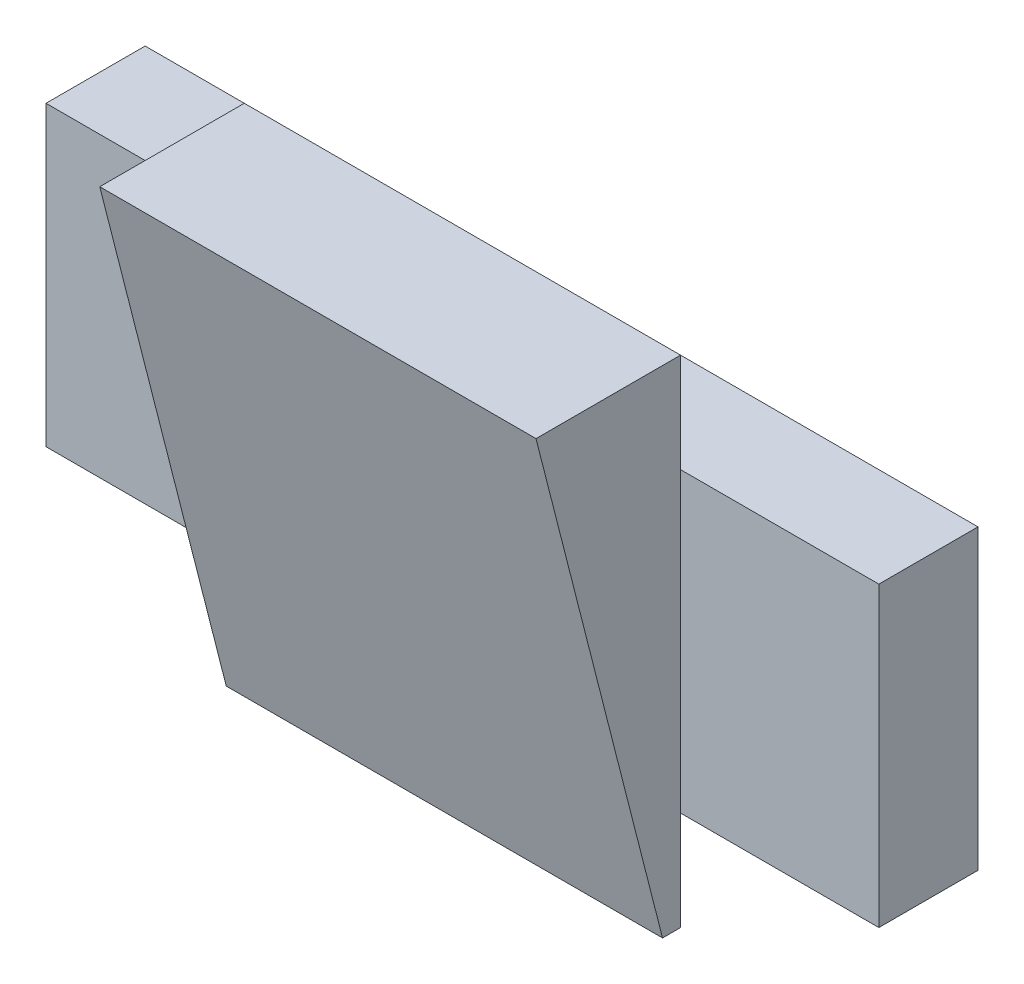
ISO-10303-21;
HEADER;
FILE_DESCRIPTION(('STEP AP214'),'2;1');
FILE_NAME('part.step','',(''),(''),'','','');
FILE_SCHEMA(('AUTOMOTIVE_DESIGN { 1 0 10303 214 1 1 1 1 }'));
ENDSEC;
DATA;
#1=APPLICATION_CONTEXT('core data for automotive mechanical design processes');
#2=APPLICATION_PROTOCOL_DEFINITION('international standard','automotive_design',2000,#1);
#3=PRODUCT_CONTEXT('',#1,'mechanical');
#4=PRODUCT('Part','Part','',(#3));
#5=PRODUCT_RELATED_PRODUCT_CATEGORY('part','',(#4));
#6=PRODUCT_DEFINITION_FORMATION('','',#4);
#7=PRODUCT_DEFINITION_CONTEXT('part definition',#1,'design');
#8=PRODUCT_DEFINITION('design','',#6,#7);
#9=PRODUCT_DEFINITION_SHAPE('','',#8);
#10=(LENGTH_UNIT() NAMED_UNIT(*) SI_UNIT(.MILLI.,.METRE.));
#11=(NAMED_UNIT(*) PLANE_ANGLE_UNIT() SI_UNIT($,.RADIAN.));
#12=(NAMED_UNIT(*) SI_UNIT($,.STERADIAN.) SOLID_ANGLE_UNIT());
#13=UNCERTAINTY_MEASURE_WITH_UNIT(LENGTH_MEASURE(1.E-05),#10,'distance_accuracy_value','');
#14=(GEOMETRIC_REPRESENTATION_CONTEXT(3) GLOBAL_UNCERTAINTY_ASSIGNED_CONTEXT((#13)) GLOBAL_UNIT_ASSIGNED_CONTEXT((#10,
#11,#12)) REPRESENTATION_CONTEXT('',''));
#15=CARTESIAN_POINT('',(0.,0.,0.));
#16=DIRECTION('',(0.,0.,1.));
#17=DIRECTION('',(1.,0.,0.));
#18=AXIS2_PLACEMENT_3D('',#15,#16,#17);
#19=CARTESIAN_POINT('',(0.,0.,5.));
#20=DIRECTION('',(0.,0.,-1.));
#21=DIRECTION('',(-1.,0.,0.));
#22=AXIS2_PLACEMENT_3D('',#19,#20,#21);
#23=PLANE('',#22);
#24=DIRECTION('',(0.,1.,0.));
#25=VECTOR('',#24,1.);
#26=CARTESIAN_POINT('',(11.,-12.5,5.));
#27=LINE('',#26,#25);
#28=CARTESIAN_POINT('',(11.,-7.5,5.));
#29=VERTEX_POINT('',#28);
#30=CARTESIAN_POINT('',(11.,7.5,5.));
#31=VERTEX_POINT('',#30);
#32=EDGE_CURVE('E11',#29,#31,#27,.T.);
#33=ORIENTED_EDGE('',*,*,#32,.F.);
#34=DIRECTION('',(1.,0.,0.));
#35=VECTOR('',#34,1.);
#36=CARTESIAN_POINT('',(-21.,-7.5,5.));
#37=LINE('',#36,#35);
#38=CARTESIAN_POINT('',(21.,-7.5,5.));
#39=VERTEX_POINT('',#38);
#40=EDGE_CURVE('E173',#29,#39,#37,.T.);
#41=ORIENTED_EDGE('',*,*,#40,.T.);
#42=DIRECTION('',(0.,1.,0.));
#43=VECTOR('',#42,1.);
#44=CARTESIAN_POINT('',(21.,-7.5,5.));
#45=LINE('',#44,#43);
#46=CARTESIAN_POINT('',(21.,7.5,5.));
#47=VERTEX_POINT('',#46);
#48=EDGE_CURVE('E159',#39,#47,#45,.T.);
#49=ORIENTED_EDGE('',*,*,#48,.T.);
#50=DIRECTION('',(-1.,0.,0.));
#51=VECTOR('',#50,1.);
#52=CARTESIAN_POINT('',(-21.,7.5,5.));
#53=LINE('',#52,#51);
#54=EDGE_CURVE('E165',#47,#31,#53,.T.);
#55=ORIENTED_EDGE('',*,*,#54,.T.);
#56=EDGE_LOOP('',(#33,#41,#49,#55));
#57=FACE_BOUND('',#56,.T.);
#58=ADVANCED_FACE('F39',(#57),#23,.F.);
#59=CARTESIAN_POINT('',(21.,-7.5,5.));
#60=DIRECTION('',(-1.,0.,0.));
#61=DIRECTION('',(0.,0.,1.));
#62=AXIS2_PLACEMENT_3D('',#59,#60,#61);
#63=PLANE('',#62);
#64=DIRECTION('',(0.,1.,0.));
#65=VECTOR('',#64,1.);
#66=CARTESIAN_POINT('',(21.,-7.5,0.));
#67=LINE('',#66,#65);
#68=CARTESIAN_POINT('',(21.,-7.5,0.));
#69=VERTEX_POINT('',#68);
#70=CARTESIAN_POINT('',(21.,7.5,0.));
#71=VERTEX_POINT('',#70);
#72=EDGE_CURVE('E158',#69,#71,#67,.T.);
#73=ORIENTED_EDGE('',*,*,#72,.T.);
#74=DIRECTION('',(0.,0.,-1.));
#75=VECTOR('',#74,1.);
#76=CARTESIAN_POINT('',(21.,7.5,5.));
#77=LINE('',#76,#75);
#78=EDGE_CURVE('E43',#47,#71,#77,.T.);
#79=ORIENTED_EDGE('',*,*,#78,.F.);
#80=ORIENTED_EDGE('',*,*,#48,.F.);
#81=DIRECTION('',(0.,0.,-1.));
#82=VECTOR('',#81,1.);
#83=CARTESIAN_POINT('',(21.,-7.5,5.));
#84=LINE('',#83,#82);
#85=EDGE_CURVE('E178',#39,#69,#84,.T.);
#86=ORIENTED_EDGE('',*,*,#85,.T.);
#87=EDGE_LOOP('',(#73,#79,#80,#86));
#88=FACE_BOUND('',#87,.T.);
#89=ADVANCED_FACE('F41',(#88),#63,.F.);
#90=CARTESIAN_POINT('',(-21.,7.5,5.));
#91=DIRECTION('',(0.,-1.,0.));
#92=DIRECTION('',(0.,0.,-1.));
#93=AXIS2_PLACEMENT_3D('',#90,#91,#92);
#94=PLANE('',#93);
#95=DIRECTION('',(-1.,0.,0.));
#96=VECTOR('',#95,1.);
#97=CARTESIAN_POINT('',(-21.,7.5,0.));
#98=LINE('',#97,#96);
#99=CARTESIAN_POINT('',(-21.,7.5,0.));
#100=VERTEX_POINT('',#99);
#101=EDGE_CURVE('E183',#71,#100,#98,.T.);
#102=ORIENTED_EDGE('',*,*,#101,.T.);
#103=DIRECTION('',(0.,0.,-1.));
#104=VECTOR('',#103,1.);
#105=CARTESIAN_POINT('',(-21.,7.5,5.));
#106=LINE('',#105,#104);
#107=CARTESIAN_POINT('',(-21.,7.5,5.));
#108=VERTEX_POINT('',#107);
#109=EDGE_CURVE('E197',#108,#100,#106,.T.);
#110=ORIENTED_EDGE('',*,*,#109,.F.);
#111=CARTESIAN_POINT('',(-11.,7.5,5.));
#112=VERTEX_POINT('',#111);
#113=EDGE_CURVE('E163',#112,#108,#53,.T.);
#114=ORIENTED_EDGE('',*,*,#113,.F.);
#115=EDGE_CURVE('E170',#31,#112,#53,.T.);
#116=ORIENTED_EDGE('',*,*,#115,.F.);
#117=ORIENTED_EDGE('',*,*,#54,.F.);
#118=ORIENTED_EDGE('',*,*,#78,.T.);
#119=EDGE_LOOP('',(#102,#110,#114,#116,#117,#118));
#120=FACE_BOUND('',#119,.T.);
#121=ADVANCED_FACE('F249',(#120),#94,.F.);
#122=CARTESIAN_POINT('',(-21.,-7.5,5.));
#123=DIRECTION('',(1.,0.,0.));
#124=DIRECTION('',(0.,0.,-1.));
#125=AXIS2_PLACEMENT_3D('',#122,#123,#124);
#126=PLANE('',#125);
#127=DIRECTION('',(0.,-1.,0.));
#128=VECTOR('',#127,1.);
#129=CARTESIAN_POINT('',(-21.,-7.5,0.));
#130=LINE('',#129,#128);
#131=CARTESIAN_POINT('',(-21.,-7.5,0.));
#132=VERTEX_POINT('',#131);
#133=EDGE_CURVE('E186',#100,#132,#130,.T.);
#134=ORIENTED_EDGE('',*,*,#133,.T.);
#135=DIRECTION('',(0.,0.,-1.));
#136=VECTOR('',#135,1.);
#137=CARTESIAN_POINT('',(-21.,-7.5,5.));
#138=LINE('',#137,#136);
#139=CARTESIAN_POINT('',(-21.,-7.5,5.));
#140=VERTEX_POINT('',#139);
#141=EDGE_CURVE('E194',#140,#132,#138,.T.);
#142=ORIENTED_EDGE('',*,*,#141,.F.);
#143=DIRECTION('',(0.,-1.,0.));
#144=VECTOR('',#143,1.);
#145=CARTESIAN_POINT('',(-21.,-7.5,5.));
#146=LINE('',#145,#144);
#147=EDGE_CURVE('E169',#108,#140,#146,.T.);
#148=ORIENTED_EDGE('',*,*,#147,.F.);
#149=ORIENTED_EDGE('',*,*,#109,.T.);
#150=EDGE_LOOP('',(#134,#142,#148,#149));
#151=FACE_BOUND('',#150,.T.);
#152=ADVANCED_FACE('F250',(#151),#126,.F.);
#153=CARTESIAN_POINT('',(-21.,-7.5,5.));
#154=DIRECTION('',(0.,1.,0.));
#155=DIRECTION('',(0.,0.,1.));
#156=AXIS2_PLACEMENT_3D('',#153,#154,#155);
#157=PLANE('',#156);
#158=DIRECTION('',(1.,0.,0.));
#159=VECTOR('',#158,1.);
#160=CARTESIAN_POINT('',(-21.,-7.5,0.));
#161=LINE('',#160,#159);
#162=EDGE_CURVE('E164',#132,#69,#161,.T.);
#163=ORIENTED_EDGE('',*,*,#162,.T.);
#164=ORIENTED_EDGE('',*,*,#85,.F.);
#165=ORIENTED_EDGE('',*,*,#40,.F.);
#166=CARTESIAN_POINT('',(-11.,-7.5,5.));
#167=VERTEX_POINT('',#166);
#168=EDGE_CURVE('E179',#167,#29,#37,.T.);
#169=ORIENTED_EDGE('',*,*,#168,.F.);
#170=EDGE_CURVE('E174',#140,#167,#37,.T.);
#171=ORIENTED_EDGE('',*,*,#170,.F.);
#172=ORIENTED_EDGE('',*,*,#141,.T.);
#173=EDGE_LOOP('',(#163,#164,#165,#169,#171,#172));
#174=FACE_BOUND('',#173,.T.);
#175=ADVANCED_FACE('F240',(#174),#157,.F.);
#176=ORIENTED_EDGE('',*,*,#170,.T.);
#177=DIRECTION('',(0.,1.,0.));
#178=VECTOR('',#177,1.);
#179=CARTESIAN_POINT('',(-11.,-12.5,5.));
#180=LINE('',#179,#178);
#181=EDGE_CURVE('E49',#167,#112,#180,.T.);
#182=ORIENTED_EDGE('',*,*,#181,.T.);
#183=ORIENTED_EDGE('',*,*,#113,.T.);
#184=ORIENTED_EDGE('',*,*,#147,.T.);
#185=EDGE_LOOP('',(#176,#182,#183,#184));
#186=FACE_BOUND('',#185,.T.);
#187=ADVANCED_FACE('F247',(#186),#23,.F.);
#188=CARTESIAN_POINT('',(0.,0.,0.));
#189=DIRECTION('',(0.,0.,-1.));
#190=DIRECTION('',(-1.,0.,0.));
#191=AXIS2_PLACEMENT_3D('',#188,#189,#190);
#192=PLANE('',#191);
#193=ORIENTED_EDGE('',*,*,#72,.F.);
#194=ORIENTED_EDGE('',*,*,#162,.F.);
#195=ORIENTED_EDGE('',*,*,#133,.F.);
#196=ORIENTED_EDGE('',*,*,#101,.F.);
#197=EDGE_LOOP('',(#193,#194,#195,#196));
#198=FACE_BOUND('',#197,.T.);
#199=ADVANCED_FACE('F254',(#198),#192,.T.);
#200=CARTESIAN_POINT('',(0.,0.,5.));
#201=DIRECTION('',(0.,0.,1.));
#202=DIRECTION('',(1.,0.,0.));
#203=AXIS2_PLACEMENT_3D('',#200,#201,#202);
#204=PLANE('',#203);
#205=CARTESIAN_POINT('',(11.,12.5,5.));
#206=VERTEX_POINT('',#205);
#207=EDGE_CURVE('E52',#31,#206,#27,.T.);
#208=ORIENTED_EDGE('',*,*,#207,.F.);
#209=ORIENTED_EDGE('',*,*,#115,.T.);
#210=CARTESIAN_POINT('',(-11.,12.5,5.));
#211=VERTEX_POINT('',#210);
#212=EDGE_CURVE('E67',#112,#211,#180,.T.);
#213=ORIENTED_EDGE('',*,*,#212,.T.);
#214=DIRECTION('',(-1.,0.,0.));
#215=VECTOR('',#214,1.);
#216=CARTESIAN_POINT('',(11.,12.5,5.));
#217=LINE('',#216,#215);
#218=EDGE_CURVE('E216',#206,#211,#217,.T.);
#219=ORIENTED_EDGE('',*,*,#218,.F.);
#220=EDGE_LOOP('',(#208,#209,#213,#219));
#221=FACE_BOUND('',#220,.T.);
#222=ADVANCED_FACE('F271',(#221),#204,.F.);
#223=CARTESIAN_POINT('',(-11.,-12.5,5.));
#224=VERTEX_POINT('',#223);
#225=EDGE_CURVE('E150',#224,#167,#180,.T.);
#226=ORIENTED_EDGE('',*,*,#225,.T.);
#227=ORIENTED_EDGE('',*,*,#168,.T.);
#228=CARTESIAN_POINT('',(11.,-12.5,5.));
#229=VERTEX_POINT('',#228);
#230=EDGE_CURVE('E51',#229,#29,#27,.T.);
#231=ORIENTED_EDGE('',*,*,#230,.F.);
#232=DIRECTION('',(-1.,0.,0.));
#233=VECTOR('',#232,1.);
#234=CARTESIAN_POINT('',(11.,-12.5,5.));
#235=LINE('',#234,#233);
#236=EDGE_CURVE('E142',#229,#224,#235,.T.);
#237=ORIENTED_EDGE('',*,*,#236,.T.);
#238=EDGE_LOOP('',(#226,#227,#231,#237));
#239=FACE_BOUND('',#238,.T.);
#240=ADVANCED_FACE('F233',(#239),#204,.F.);
#241=CARTESIAN_POINT('',(11.,-12.5,14.5));
#242=DIRECTION('',(-1.,0.,0.));
#243=DIRECTION('',(0.,0.,1.));
#244=AXIS2_PLACEMENT_3D('',#241,#242,#243);
#245=PLANE('',#244);
#246=DIRECTION('',(0.,0.,-1.));
#247=VECTOR('',#246,1.);
#248=CARTESIAN_POINT('',(11.,12.5,14.5));
#249=LINE('',#248,#247);
#250=CARTESIAN_POINT('',(11.,12.5,12.2894496802472));
#251=VERTEX_POINT('',#250);
#252=EDGE_CURVE('E136',#251,#206,#249,.T.);
#253=ORIENTED_EDGE('',*,*,#252,.F.);
#254=DIRECTION('',(0.,0.96894355857136,0.2472819853994));
#255=VECTOR('',#254,1.);
#256=CARTESIAN_POINT('',(11.,12.5,12.2894496802472));
#257=LINE('',#256,#255);
#258=CARTESIAN_POINT('',(11.,-12.5,5.90925386770682));
#259=VERTEX_POINT('',#258);
#260=EDGE_CURVE('E121',#259,#251,#257,.T.);
#261=ORIENTED_EDGE('',*,*,#260,.F.);
#262=DIRECTION('',(0.,0.,-1.));
#263=VECTOR('',#262,1.);
#264=CARTESIAN_POINT('',(11.,-12.5,14.5));
#265=LINE('',#264,#263);
#266=EDGE_CURVE('E133',#259,#229,#265,.T.);
#267=ORIENTED_EDGE('',*,*,#266,.T.);
#268=ORIENTED_EDGE('',*,*,#230,.T.);
#269=ORIENTED_EDGE('',*,*,#32,.T.);
#270=ORIENTED_EDGE('',*,*,#207,.T.);
#271=EDGE_LOOP('',(#253,#261,#267,#268,#269,#270));
#272=FACE_BOUND('',#271,.T.);
#273=ADVANCED_FACE('F131',(#272),#245,.F.);
#274=CARTESIAN_POINT('',(11.,12.5,14.5));
#275=DIRECTION('',(0.,-1.,0.));
#276=DIRECTION('',(0.,0.,-1.));
#277=AXIS2_PLACEMENT_3D('',#274,#275,#276);
#278=PLANE('',#277);
#279=DIRECTION('',(0.,0.,-1.));
#280=VECTOR('',#279,1.);
#281=CARTESIAN_POINT('',(-11.,12.5,14.5));
#282=LINE('',#281,#280);
#283=CARTESIAN_POINT('',(-11.,12.5,12.2894496802472));
#284=VERTEX_POINT('',#283);
#285=EDGE_CURVE('E148',#284,#211,#282,.T.);
#286=ORIENTED_EDGE('',*,*,#285,.F.);
#287=DIRECTION('',(1.,0.,0.));
#288=VECTOR('',#287,1.);
#289=CARTESIAN_POINT('',(-26.,12.5,12.2894496802472));
#290=LINE('',#289,#288);
#291=EDGE_CURVE('E127',#284,#251,#290,.T.);
#292=ORIENTED_EDGE('',*,*,#291,.T.);
#293=ORIENTED_EDGE('',*,*,#252,.T.);
#294=ORIENTED_EDGE('',*,*,#218,.T.);
#295=EDGE_LOOP('',(#286,#292,#293,#294));
#296=FACE_BOUND('',#295,.T.);
#297=ADVANCED_FACE('F228',(#296),#278,.F.);
#298=CARTESIAN_POINT('',(-11.,-12.5,14.5));
#299=DIRECTION('',(-1.,0.,0.));
#300=DIRECTION('',(0.,0.,1.));
#301=AXIS2_PLACEMENT_3D('',#298,#299,#300);
#302=PLANE('',#301);
#303=DIRECTION('',(0.,-0.96894355857136,-0.2472819853994));
#304=VECTOR('',#303,1.);
#305=CARTESIAN_POINT('',(-11.,-10.4416375804953,6.4345640792914));
#306=LINE('',#305,#304);
#307=CARTESIAN_POINT('',(-11.,-12.5,5.90925386770682));
#308=VERTEX_POINT('',#307);
#309=EDGE_CURVE('E59',#284,#308,#306,.T.);
#310=ORIENTED_EDGE('',*,*,#309,.F.);
#311=ORIENTED_EDGE('',*,*,#285,.T.);
#312=ORIENTED_EDGE('',*,*,#212,.F.);
#313=ORIENTED_EDGE('',*,*,#181,.F.);
#314=ORIENTED_EDGE('',*,*,#225,.F.);
#315=DIRECTION('',(0.,0.,-1.));
#316=VECTOR('',#315,1.);
#317=CARTESIAN_POINT('',(-11.,-12.5,14.5));
#318=LINE('',#317,#316);
#319=EDGE_CURVE('E144',#308,#224,#318,.T.);
#320=ORIENTED_EDGE('',*,*,#319,.F.);
#321=EDGE_LOOP('',(#310,#311,#312,#313,#314,#320));
#322=FACE_BOUND('',#321,.T.);
#323=ADVANCED_FACE('F229',(#322),#302,.T.);
#324=CARTESIAN_POINT('',(11.,-12.5,14.5));
#325=DIRECTION('',(0.,-1.,0.));
#326=DIRECTION('',(0.,0.,-1.));
#327=AXIS2_PLACEMENT_3D('',#324,#325,#326);
#328=PLANE('',#327);
#329=DIRECTION('',(1.,0.,0.));
#330=VECTOR('',#329,1.);
#331=CARTESIAN_POINT('',(-26.,-12.5,5.90925386770682));
#332=LINE('',#331,#330);
#333=EDGE_CURVE('E118',#308,#259,#332,.T.);
#334=ORIENTED_EDGE('',*,*,#333,.F.);
#335=ORIENTED_EDGE('',*,*,#319,.T.);
#336=ORIENTED_EDGE('',*,*,#236,.F.);
#337=ORIENTED_EDGE('',*,*,#266,.F.);
#338=EDGE_LOOP('',(#334,#335,#336,#337));
#339=FACE_BOUND('',#338,.T.);
#340=ADVANCED_FACE('F140',(#339),#328,.T.);
#341=CARTESIAN_POINT('',(-26.,12.5,12.2894496802472));
#342=DIRECTION('',(0.,0.2472819853994,-0.96894355857136));
#343=DIRECTION('',(0.,0.96894355857136,0.2472819853994));
#344=AXIS2_PLACEMENT_3D('',#341,#342,#343);
#345=PLANE('',#344);
#346=ORIENTED_EDGE('',*,*,#309,.T.);
#347=ORIENTED_EDGE('',*,*,#333,.T.);
#348=ORIENTED_EDGE('',*,*,#260,.T.);
#349=ORIENTED_EDGE('',*,*,#291,.F.);
#350=EDGE_LOOP('',(#346,#347,#348,#349));
#351=FACE_BOUND('',#350,.T.);
#352=ADVANCED_FACE('F120',(#351),#345,.F.);
#353=CLOSED_SHELL('',(#58,#89,#121,#152,#175,#187,#199,#222,#240,#273,#297,#323,#340,#352));
#354=MANIFOLD_SOLID_BREP('B2',#353);
#355=ADVANCED_BREP_SHAPE_REPRESENTATION('',(#18,#354),#14);
#356=SHAPE_DEFINITION_REPRESENTATION(#9,#355);
ENDSEC;
END-ISO-10303-21;
